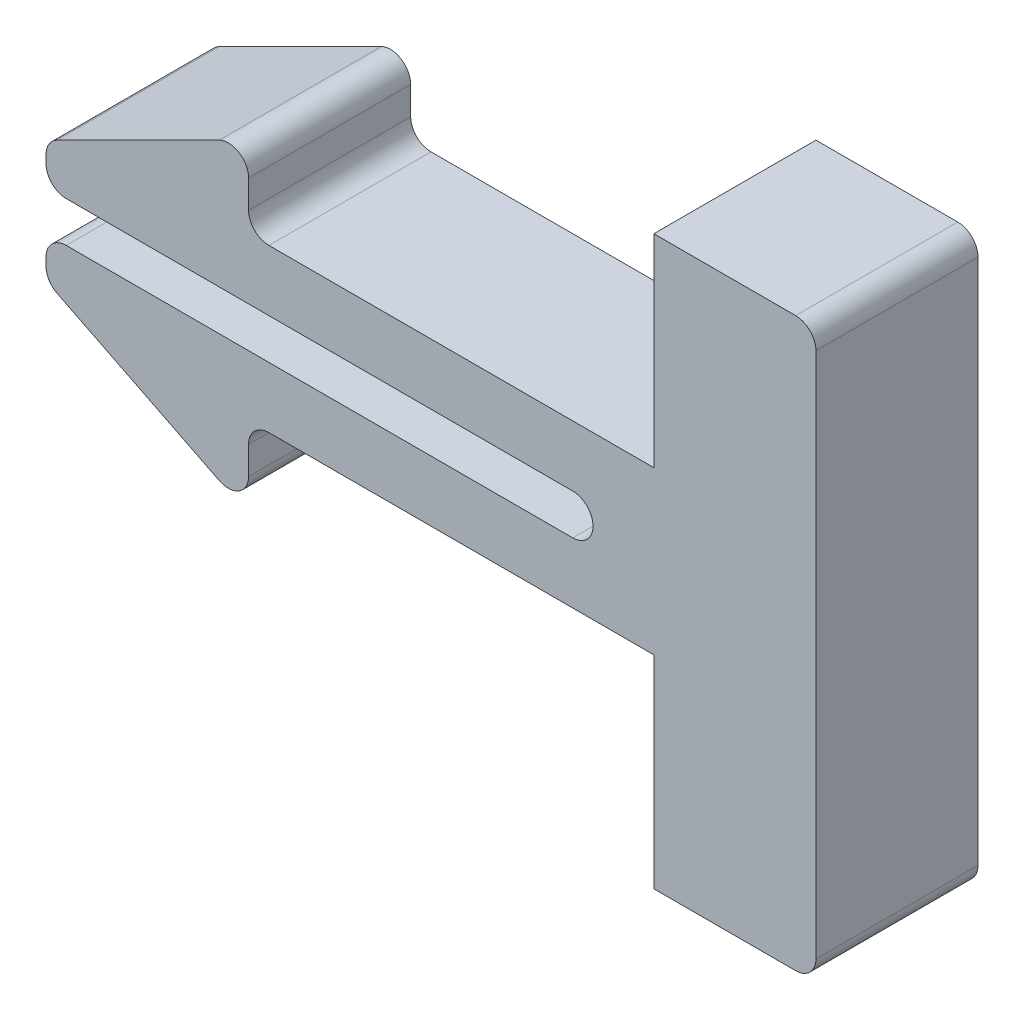
ISO-10303-21;
HEADER;
FILE_DESCRIPTION(('STEP AP214'),'2;1');
FILE_NAME('part.step','',(''),(''),'','','');
FILE_SCHEMA(('AUTOMOTIVE_DESIGN { 1 0 10303 214 1 1 1 1 }'));
ENDSEC;
DATA;
#1=APPLICATION_CONTEXT('core data for automotive mechanical design processes');
#2=APPLICATION_PROTOCOL_DEFINITION('international standard','automotive_design',2000,#1);
#3=PRODUCT_CONTEXT('',#1,'mechanical');
#4=PRODUCT('Part','Part','',(#3));
#5=PRODUCT_RELATED_PRODUCT_CATEGORY('part','',(#4));
#6=PRODUCT_DEFINITION_FORMATION('','',#4);
#7=PRODUCT_DEFINITION_CONTEXT('part definition',#1,'design');
#8=PRODUCT_DEFINITION('design','',#6,#7);
#9=PRODUCT_DEFINITION_SHAPE('','',#8);
#10=(LENGTH_UNIT() NAMED_UNIT(*) SI_UNIT(.MILLI.,.METRE.));
#11=(NAMED_UNIT(*) PLANE_ANGLE_UNIT() SI_UNIT($,.RADIAN.));
#12=(NAMED_UNIT(*) SI_UNIT($,.STERADIAN.) SOLID_ANGLE_UNIT());
#13=UNCERTAINTY_MEASURE_WITH_UNIT(LENGTH_MEASURE(1.E-05),#10,'distance_accuracy_value','');
#14=(GEOMETRIC_REPRESENTATION_CONTEXT(3) GLOBAL_UNCERTAINTY_ASSIGNED_CONTEXT((#13)) GLOBAL_UNIT_ASSIGNED_CONTEXT((#10,
#11,#12)) REPRESENTATION_CONTEXT('',''));
#15=CARTESIAN_POINT('',(0.,0.,0.));
#16=DIRECTION('',(0.,0.,1.));
#17=DIRECTION('',(1.,0.,0.));
#18=AXIS2_PLACEMENT_3D('',#15,#16,#17);
#19=CARTESIAN_POINT('',(17.7568132742083,178.880197559472,-174.481230173254));
#20=DIRECTION('',(0.,-1.,0.));
#21=DIRECTION('',(0.,0.,-1.));
#22=AXIS2_PLACEMENT_3D('',#19,#20,#21);
#23=PLANE('',#22);
#24=DIRECTION('',(1.,0.,0.));
#25=VECTOR('',#24,1.);
#26=CARTESIAN_POINT('',(17.7568132742083,178.880197559472,-7.99999999999998));
#27=LINE('',#26,#25);
#28=CARTESIAN_POINT('',(9.75681327420834,178.880197559472,-7.99999999999998));
#29=VERTEX_POINT('',#28);
#30=CARTESIAN_POINT('',(16.7568132742083,178.880197559472,-7.99999999999998));
#31=VERTEX_POINT('',#30);
#32=EDGE_CURVE('E234',#29,#31,#27,.T.);
#33=ORIENTED_EDGE('',*,*,#32,.T.);
#34=DIRECTION('',(0.,0.,1.));
#35=VECTOR('',#34,1.);
#36=CARTESIAN_POINT('',(16.7568132742083,178.880197559472,-174.481230173254));
#37=LINE('',#36,#35);
#38=CARTESIAN_POINT('',(16.7568132742083,178.880197559472,0.));
#39=VERTEX_POINT('',#38);
#40=EDGE_CURVE('E240',#31,#39,#37,.T.);
#41=ORIENTED_EDGE('',*,*,#40,.T.);
#42=DIRECTION('',(1.,0.,0.));
#43=VECTOR('',#42,1.);
#44=CARTESIAN_POINT('',(17.7568132742083,178.880197559472,0.));
#45=LINE('',#44,#43);
#46=CARTESIAN_POINT('',(9.75681327420834,178.880197559472,0.));
#47=VERTEX_POINT('',#46);
#48=EDGE_CURVE('E238',#47,#39,#45,.T.);
#49=ORIENTED_EDGE('',*,*,#48,.F.);
#50=DIRECTION('',(0.,0.,1.));
#51=VECTOR('',#50,1.);
#52=CARTESIAN_POINT('',(9.75681327420834,178.880197559472,-174.481230173254));
#53=LINE('',#52,#51);
#54=EDGE_CURVE('E224',#29,#47,#53,.T.);
#55=ORIENTED_EDGE('',*,*,#54,.F.);
#56=EDGE_LOOP('',(#33,#41,#49,#55));
#57=FACE_BOUND('',#56,.T.);
#58=ADVANCED_FACE('F45',(#57),#23,.T.);
#59=CARTESIAN_POINT('',(9.75681327420834,178.880197559472,-174.481230173254));
#60=DIRECTION('',(-1.,0.,0.));
#61=DIRECTION('',(0.,0.,1.));
#62=AXIS2_PLACEMENT_3D('',#59,#60,#61);
#63=PLANE('',#62);
#64=DIRECTION('',(0.,0.,1.));
#65=VECTOR('',#64,1.);
#66=CARTESIAN_POINT('',(9.75681327420834,188.880197559472,-174.481230173254));
#67=LINE('',#66,#65);
#68=CARTESIAN_POINT('',(9.75681327420834,188.880197559472,-7.99999999999998));
#69=VERTEX_POINT('',#68);
#70=CARTESIAN_POINT('',(9.75681327420834,188.880197559472,0.));
#71=VERTEX_POINT('',#70);
#72=EDGE_CURVE('E290',#69,#71,#67,.T.);
#73=ORIENTED_EDGE('',*,*,#72,.F.);
#74=DIRECTION('',(0.,-1.,0.));
#75=VECTOR('',#74,1.);
#76=CARTESIAN_POINT('',(9.75681327420834,178.880197559472,-7.99999999999998));
#77=LINE('',#76,#75);
#78=EDGE_CURVE('E231',#69,#29,#77,.T.);
#79=ORIENTED_EDGE('',*,*,#78,.T.);
#80=ORIENTED_EDGE('',*,*,#54,.T.);
#81=DIRECTION('',(0.,-1.,0.));
#82=VECTOR('',#81,1.);
#83=CARTESIAN_POINT('',(9.75681327420834,178.880197559472,0.));
#84=LINE('',#83,#82);
#85=EDGE_CURVE('E229',#71,#47,#84,.T.);
#86=ORIENTED_EDGE('',*,*,#85,.F.);
#87=EDGE_LOOP('',(#73,#79,#80,#86));
#88=FACE_BOUND('',#87,.T.);
#89=ADVANCED_FACE('F227',(#88),#63,.T.);
#90=CARTESIAN_POINT('',(9.75681327420834,188.880197559472,-174.481230173254));
#91=DIRECTION('',(0.,-1.,0.));
#92=DIRECTION('',(1.,0.,0.));
#93=AXIS2_PLACEMENT_3D('',#90,#91,#92);
#94=PLANE('',#93);
#95=DIRECTION('',(1.,0.,0.));
#96=VECTOR('',#95,1.);
#97=CARTESIAN_POINT('',(9.75681327420834,188.880197559472,0.));
#98=LINE('',#97,#96);
#99=CARTESIAN_POINT('',(-9.24318672579167,188.880197559472,0.));
#100=VERTEX_POINT('',#99);
#101=EDGE_CURVE('E247',#100,#71,#98,.T.);
#102=ORIENTED_EDGE('',*,*,#101,.F.);
#103=DIRECTION('',(0.,0.,1.));
#104=VECTOR('',#103,1.);
#105=CARTESIAN_POINT('',(-9.24318672579167,188.880197559472,-7.99999999999998));
#106=LINE('',#105,#104);
#107=CARTESIAN_POINT('',(-9.24318672579167,188.880197559472,-7.99999999999998));
#108=VERTEX_POINT('',#107);
#109=EDGE_CURVE('E368',#100,#108,#106,.F.);
#110=ORIENTED_EDGE('',*,*,#109,.T.);
#111=DIRECTION('',(1.,0.,0.));
#112=VECTOR('',#111,1.);
#113=CARTESIAN_POINT('',(9.75681327420834,188.880197559472,-7.99999999999998));
#114=LINE('',#113,#112);
#115=EDGE_CURVE('E291',#108,#69,#114,.T.);
#116=ORIENTED_EDGE('',*,*,#115,.T.);
#117=ORIENTED_EDGE('',*,*,#72,.T.);
#118=EDGE_LOOP('',(#102,#110,#116,#117));
#119=FACE_BOUND('',#118,.T.);
#120=ADVANCED_FACE('F464',(#119),#94,.T.);
#121=CARTESIAN_POINT('',(-9.24318672579167,187.880197559472,-174.481230173254));
#122=DIRECTION('',(0.,0.,-1.));
#123=DIRECTION('',(-1.,0.,0.));
#124=AXIS2_PLACEMENT_3D('',#121,#122,#123);
#125=CYLINDRICAL_SURFACE('',#124,1.);
#126=CARTESIAN_POINT('',(-9.24318672579167,187.880197559472,-7.99999999999998));
#127=DIRECTION('',(0.,0.,-1.));
#128=DIRECTION('',(0.,1.,0.));
#129=AXIS2_PLACEMENT_3D('',#126,#127,#128);
#130=CIRCLE('',#129,1.);
#131=CARTESIAN_POINT('',(-10.2431867257917,187.880197559472,-7.99999999999998));
#132=VERTEX_POINT('',#131);
#133=EDGE_CURVE('E428',#108,#132,#130,.F.);
#134=ORIENTED_EDGE('',*,*,#133,.F.);
#135=ORIENTED_EDGE('',*,*,#109,.F.);
#136=CARTESIAN_POINT('',(-9.24318672579167,187.880197559472,0.));
#137=DIRECTION('',(0.,0.,-1.));
#138=DIRECTION('',(-1.,0.,0.));
#139=AXIS2_PLACEMENT_3D('',#136,#137,#138);
#140=CIRCLE('',#139,1.);
#141=CARTESIAN_POINT('',(-10.2431867257917,187.880197559472,0.));
#142=VERTEX_POINT('',#141);
#143=EDGE_CURVE('E426',#142,#100,#140,.T.);
#144=ORIENTED_EDGE('',*,*,#143,.F.);
#145=DIRECTION('',(0.,0.,1.));
#146=VECTOR('',#145,1.);
#147=CARTESIAN_POINT('',(-10.2431867257917,187.880197559472,0.));
#148=LINE('',#147,#146);
#149=EDGE_CURVE('E365',#132,#142,#148,.T.);
#150=ORIENTED_EDGE('',*,*,#149,.F.);
#151=EDGE_LOOP('',(#134,#135,#144,#150));
#152=FACE_BOUND('',#151,.T.);
#153=ADVANCED_FACE('F467',(#152),#125,.F.);
#154=CARTESIAN_POINT('',(-10.2431867257917,184.880197559472,-174.481230173254));
#155=DIRECTION('',(1.,0.,0.));
#156=DIRECTION('',(0.,1.,0.));
#157=AXIS2_PLACEMENT_3D('',#154,#155,#156);
#158=PLANE('',#157);
#159=DIRECTION('',(0.,1.,0.));
#160=VECTOR('',#159,1.);
#161=CARTESIAN_POINT('',(-10.2431867257917,184.880197559472,-7.99999999999998));
#162=LINE('',#161,#160);
#163=CARTESIAN_POINT('',(-10.2431867257917,186.498231548222,-7.99999999999998));
#164=VERTEX_POINT('',#163);
#165=EDGE_CURVE('E293',#164,#132,#162,.T.);
#166=ORIENTED_EDGE('',*,*,#165,.T.);
#167=ORIENTED_EDGE('',*,*,#149,.T.);
#168=DIRECTION('',(0.,1.,0.));
#169=VECTOR('',#168,1.);
#170=CARTESIAN_POINT('',(-10.2431867257917,184.880197559472,0.));
#171=LINE('',#170,#169);
#172=CARTESIAN_POINT('',(-10.2431867257917,186.498231548222,0.));
#173=VERTEX_POINT('',#172);
#174=EDGE_CURVE('E250',#173,#142,#171,.T.);
#175=ORIENTED_EDGE('',*,*,#174,.F.);
#176=DIRECTION('',(0.,0.,1.));
#177=VECTOR('',#176,1.);
#178=CARTESIAN_POINT('',(-10.2431867257917,186.498231548222,-174.481230173254));
#179=LINE('',#178,#177);
#180=EDGE_CURVE('E361',#173,#164,#179,.F.);
#181=ORIENTED_EDGE('',*,*,#180,.T.);
#182=EDGE_LOOP('',(#166,#167,#175,#181));
#183=FACE_BOUND('',#182,.T.);
#184=ADVANCED_FACE('F472',(#183),#158,.T.);
#185=CARTESIAN_POINT('',(-11.2431867257917,186.498231548222,-174.481230173254));
#186=DIRECTION('',(0.,0.,1.));
#187=DIRECTION('',(1.,0.,0.));
#188=AXIS2_PLACEMENT_3D('',#185,#186,#187);
#189=CYLINDRICAL_SURFACE('',#188,1.);
#190=CARTESIAN_POINT('',(-11.2431867257917,186.498231548222,-7.99999999999998));
#191=DIRECTION('',(0.,0.,-1.));
#192=DIRECTION('',(0.,1.,0.));
#193=AXIS2_PLACEMENT_3D('',#190,#191,#192);
#194=CIRCLE('',#193,1.);
#195=CARTESIAN_POINT('',(-11.6904003212916,185.603804357222,-7.99999999999998));
#196=VERTEX_POINT('',#195);
#197=EDGE_CURVE('E396',#164,#196,#194,.T.);
#198=ORIENTED_EDGE('',*,*,#197,.F.);
#199=ORIENTED_EDGE('',*,*,#180,.F.);
#200=CARTESIAN_POINT('',(-11.2431867257917,186.498231548222,0.));
#201=DIRECTION('',(0.,0.,-1.));
#202=DIRECTION('',(-1.,0.,0.));
#203=AXIS2_PLACEMENT_3D('',#200,#201,#202);
#204=CIRCLE('',#203,1.);
#205=CARTESIAN_POINT('',(-11.6904003212916,185.603804357222,0.));
#206=VERTEX_POINT('',#205);
#207=EDGE_CURVE('E385',#206,#173,#204,.F.);
#208=ORIENTED_EDGE('',*,*,#207,.F.);
#209=DIRECTION('',(0.,0.,1.));
#210=VECTOR('',#209,1.);
#211=CARTESIAN_POINT('',(-11.6904003212916,185.603804357222,-174.481230173254));
#212=LINE('',#211,#210);
#213=EDGE_CURVE('E372',#196,#206,#212,.T.);
#214=ORIENTED_EDGE('',*,*,#213,.F.);
#215=EDGE_LOOP('',(#198,#199,#208,#214));
#216=FACE_BOUND('',#215,.T.);
#217=ADVANCED_FACE('F476',(#216),#189,.T.);
#218=CARTESIAN_POINT('',(-20.2431867257917,189.880197559472,-174.481230173254));
#219=DIRECTION('',(-0.447213595499958,-0.894427190999916,0.));
#220=DIRECTION('',(0.894427190999916,-0.447213595499958,0.));
#221=AXIS2_PLACEMENT_3D('',#218,#219,#220);
#222=PLANE('',#221);
#223=DIRECTION('',(0.894427190999916,-0.447213595499958,0.));
#224=VECTOR('',#223,1.);
#225=CARTESIAN_POINT('',(-20.2431867257917,189.880197559472,-7.99999999999998));
#226=LINE('',#225,#224);
#227=CARTESIAN_POINT('',(-19.6904003212916,189.603804357222,-7.99999999999998));
#228=VERTEX_POINT('',#227);
#229=EDGE_CURVE('E296',#228,#196,#226,.T.);
#230=ORIENTED_EDGE('',*,*,#229,.T.);
#231=ORIENTED_EDGE('',*,*,#213,.T.);
#232=DIRECTION('',(0.894427190999916,-0.447213595499958,0.));
#233=VECTOR('',#232,1.);
#234=CARTESIAN_POINT('',(-20.2431867257917,189.880197559472,0.));
#235=LINE('',#234,#233);
#236=CARTESIAN_POINT('',(-19.6904003212916,189.603804357222,0.));
#237=VERTEX_POINT('',#236);
#238=EDGE_CURVE('E255',#237,#206,#235,.T.);
#239=ORIENTED_EDGE('',*,*,#238,.F.);
#240=DIRECTION('',(0.,0.,1.));
#241=VECTOR('',#240,1.);
#242=CARTESIAN_POINT('',(-19.6904003212916,189.603804357222,-174.481230173254));
#243=LINE('',#242,#241);
#244=EDGE_CURVE('E370',#237,#228,#243,.F.);
#245=ORIENTED_EDGE('',*,*,#244,.T.);
#246=EDGE_LOOP('',(#230,#231,#239,#245));
#247=FACE_BOUND('',#246,.T.);
#248=ADVANCED_FACE('F481',(#247),#222,.T.);
#249=CARTESIAN_POINT('',(-19.2431867257917,190.498231548222,-174.481230173254));
#250=DIRECTION('',(0.,0.,1.));
#251=DIRECTION('',(1.,0.,0.));
#252=AXIS2_PLACEMENT_3D('',#249,#250,#251);
#253=CYLINDRICAL_SURFACE('',#252,1.);
#254=CARTESIAN_POINT('',(-19.2431867257917,190.498231548222,-7.99999999999998));
#255=DIRECTION('',(0.,0.,-1.));
#256=DIRECTION('',(0.,1.,0.));
#257=AXIS2_PLACEMENT_3D('',#254,#255,#256);
#258=CIRCLE('',#257,1.);
#259=CARTESIAN_POINT('',(-20.2431867257917,190.498231548222,-7.99999999999998));
#260=VERTEX_POINT('',#259);
#261=EDGE_CURVE('E394',#228,#260,#258,.T.);
#262=ORIENTED_EDGE('',*,*,#261,.F.);
#263=ORIENTED_EDGE('',*,*,#244,.F.);
#264=CARTESIAN_POINT('',(-19.2431867257917,190.498231548222,0.));
#265=DIRECTION('',(0.,0.,-1.));
#266=DIRECTION('',(-1.,0.,0.));
#267=AXIS2_PLACEMENT_3D('',#264,#265,#266);
#268=CIRCLE('',#267,1.);
#269=CARTESIAN_POINT('',(-20.2431867257917,190.498231548222,0.));
#270=VERTEX_POINT('',#269);
#271=EDGE_CURVE('E383',#270,#237,#268,.F.);
#272=ORIENTED_EDGE('',*,*,#271,.F.);
#273=DIRECTION('',(0.,0.,1.));
#274=VECTOR('',#273,1.);
#275=CARTESIAN_POINT('',(-20.2431867257917,190.498231548222,-174.481230173254));
#276=LINE('',#275,#274);
#277=EDGE_CURVE('E400',#260,#270,#276,.T.);
#278=ORIENTED_EDGE('',*,*,#277,.F.);
#279=EDGE_LOOP('',(#262,#263,#272,#278));
#280=FACE_BOUND('',#279,.T.);
#281=ADVANCED_FACE('F485',(#280),#253,.T.);
#282=CARTESIAN_POINT('',(-20.2431867257917,191.880197559472,-174.481230173254));
#283=DIRECTION('',(-1.,0.,0.));
#284=DIRECTION('',(0.,0.,1.));
#285=AXIS2_PLACEMENT_3D('',#282,#283,#284);
#286=PLANE('',#285);
#287=DIRECTION('',(0.,-1.,0.));
#288=VECTOR('',#287,1.);
#289=CARTESIAN_POINT('',(-20.2431867257917,191.880197559472,-7.99999999999998));
#290=LINE('',#289,#288);
#291=CARTESIAN_POINT('',(-20.2431867257917,190.880197559472,-7.99999999999998));
#292=VERTEX_POINT('',#291);
#293=EDGE_CURVE('E299',#292,#260,#290,.T.);
#294=ORIENTED_EDGE('',*,*,#293,.T.);
#295=ORIENTED_EDGE('',*,*,#277,.T.);
#296=DIRECTION('',(0.,-1.,0.));
#297=VECTOR('',#296,1.);
#298=CARTESIAN_POINT('',(-20.2431867257917,191.880197559472,0.));
#299=LINE('',#298,#297);
#300=CARTESIAN_POINT('',(-20.2431867257917,190.880197559472,0.));
#301=VERTEX_POINT('',#300);
#302=EDGE_CURVE('E258',#301,#270,#299,.T.);
#303=ORIENTED_EDGE('',*,*,#302,.F.);
#304=DIRECTION('',(0.,0.,1.));
#305=VECTOR('',#304,1.);
#306=CARTESIAN_POINT('',(-20.2431867257917,190.880197559472,-174.481230173254));
#307=LINE('',#306,#305);
#308=EDGE_CURVE('E398',#301,#292,#307,.F.);
#309=ORIENTED_EDGE('',*,*,#308,.T.);
#310=EDGE_LOOP('',(#294,#295,#303,#309));
#311=FACE_BOUND('',#310,.T.);
#312=ADVANCED_FACE('F490',(#311),#286,.T.);
#313=CARTESIAN_POINT('',(-19.2431867257917,190.880197559472,-174.481230173254));
#314=DIRECTION('',(0.,0.,1.));
#315=DIRECTION('',(1.,0.,0.));
#316=AXIS2_PLACEMENT_3D('',#313,#314,#315);
#317=CYLINDRICAL_SURFACE('',#316,1.);
#318=CARTESIAN_POINT('',(-19.2431867257917,190.880197559472,-7.99999999999998));
#319=DIRECTION('',(0.,0.,-1.));
#320=DIRECTION('',(0.,1.,0.));
#321=AXIS2_PLACEMENT_3D('',#318,#319,#320);
#322=CIRCLE('',#321,1.);
#323=CARTESIAN_POINT('',(-19.2431867257917,191.880197559472,-7.99999999999998));
#324=VERTEX_POINT('',#323);
#325=EDGE_CURVE('E392',#292,#324,#322,.T.);
#326=ORIENTED_EDGE('',*,*,#325,.F.);
#327=ORIENTED_EDGE('',*,*,#308,.F.);
#328=CARTESIAN_POINT('',(-19.2431867257917,190.880197559472,0.));
#329=DIRECTION('',(0.,0.,-1.));
#330=DIRECTION('',(-1.,0.,0.));
#331=AXIS2_PLACEMENT_3D('',#328,#329,#330);
#332=CIRCLE('',#331,1.);
#333=CARTESIAN_POINT('',(-19.2431867257917,191.880197559472,0.));
#334=VERTEX_POINT('',#333);
#335=EDGE_CURVE('E381',#334,#301,#332,.F.);
#336=ORIENTED_EDGE('',*,*,#335,.F.);
#337=DIRECTION('',(0.,0.,1.));
#338=VECTOR('',#337,1.);
#339=CARTESIAN_POINT('',(-19.2431867257917,191.880197559472,-174.481230173254));
#340=LINE('',#339,#338);
#341=EDGE_CURVE('E403',#324,#334,#340,.T.);
#342=ORIENTED_EDGE('',*,*,#341,.F.);
#343=EDGE_LOOP('',(#326,#327,#336,#342));
#344=FACE_BOUND('',#343,.T.);
#345=ADVANCED_FACE('F494',(#344),#317,.T.);
#346=CARTESIAN_POINT('',(6.75681327420834,191.880197559472,-174.481230173254));
#347=DIRECTION('',(0.,1.,0.));
#348=DIRECTION('',(0.,0.,1.));
#349=AXIS2_PLACEMENT_3D('',#346,#347,#348);
#350=PLANE('',#349);
#351=DIRECTION('',(-1.,0.,0.));
#352=VECTOR('',#351,1.);
#353=CARTESIAN_POINT('',(6.75681327420834,191.880197559472,-7.99999999999998));
#354=LINE('',#353,#352);
#355=CARTESIAN_POINT('',(5.75681327420834,191.880197559472,-7.99999999999998));
#356=VERTEX_POINT('',#355);
#357=EDGE_CURVE('E302',#356,#324,#354,.T.);
#358=ORIENTED_EDGE('',*,*,#357,.T.);
#359=ORIENTED_EDGE('',*,*,#341,.T.);
#360=DIRECTION('',(-1.,0.,0.));
#361=VECTOR('',#360,1.);
#362=CARTESIAN_POINT('',(6.75681327420834,191.880197559472,0.));
#363=LINE('',#362,#361);
#364=CARTESIAN_POINT('',(5.75681327420834,191.880197559472,0.));
#365=VERTEX_POINT('',#364);
#366=EDGE_CURVE('E261',#365,#334,#363,.T.);
#367=ORIENTED_EDGE('',*,*,#366,.F.);
#368=DIRECTION('',(0.,0.,1.));
#369=VECTOR('',#368,1.);
#370=CARTESIAN_POINT('',(5.75681327420834,191.880197559472,-7.99999999999998));
#371=LINE('',#370,#369);
#372=EDGE_CURVE('E346',#365,#356,#371,.F.);
#373=ORIENTED_EDGE('',*,*,#372,.T.);
#374=EDGE_LOOP('',(#358,#359,#367,#373));
#375=FACE_BOUND('',#374,.T.);
#376=ADVANCED_FACE('F498',(#375),#350,.T.);
#377=CARTESIAN_POINT('',(5.75681327420834,192.880197559472,-174.481230173254));
#378=DIRECTION('',(0.,0.,-1.));
#379=DIRECTION('',(-1.,0.,0.));
#380=AXIS2_PLACEMENT_3D('',#377,#378,#379);
#381=CYLINDRICAL_SURFACE('',#380,1.);
#382=CARTESIAN_POINT('',(5.75681327420834,192.880197559472,-7.99999999999998));
#383=DIRECTION('',(0.,0.,-1.));
#384=DIRECTION('',(0.,1.,0.));
#385=AXIS2_PLACEMENT_3D('',#382,#383,#384);
#386=CIRCLE('',#385,1.);
#387=CARTESIAN_POINT('',(6.75681327420834,192.880197559472,-7.99999999999998));
#388=VERTEX_POINT('',#387);
#389=EDGE_CURVE('E354',#356,#388,#386,.F.);
#390=ORIENTED_EDGE('',*,*,#389,.F.);
#391=ORIENTED_EDGE('',*,*,#372,.F.);
#392=CARTESIAN_POINT('',(5.75681327420834,192.880197559472,0.));
#393=DIRECTION('',(0.,0.,-1.));
#394=DIRECTION('',(-1.,0.,0.));
#395=AXIS2_PLACEMENT_3D('',#392,#393,#394);
#396=CIRCLE('',#395,1.);
#397=CARTESIAN_POINT('',(6.75681327420834,192.880197559472,0.));
#398=VERTEX_POINT('',#397);
#399=EDGE_CURVE('E352',#398,#365,#396,.T.);
#400=ORIENTED_EDGE('',*,*,#399,.F.);
#401=DIRECTION('',(0.,0.,1.));
#402=VECTOR('',#401,1.);
#403=CARTESIAN_POINT('',(6.75681327420834,192.880197559472,-7.99999999999998));
#404=LINE('',#403,#402);
#405=EDGE_CURVE('E286',#398,#388,#404,.F.);
#406=ORIENTED_EDGE('',*,*,#405,.T.);
#407=EDGE_LOOP('',(#390,#391,#400,#406));
#408=FACE_BOUND('',#407,.T.);
#409=ADVANCED_FACE('F503',(#408),#381,.F.);
#410=CARTESIAN_POINT('',(5.75681327420834,192.880197559472,-174.481230173254));
#411=DIRECTION('',(0.,0.,-1.));
#412=DIRECTION('',(-1.,0.,0.));
#413=AXIS2_PLACEMENT_3D('',#410,#411,#412);
#414=CYLINDRICAL_SURFACE('',#413,1.);
#415=DIRECTION('',(0.,0.,1.));
#416=VECTOR('',#415,1.);
#417=CARTESIAN_POINT('',(5.75681327420834,193.880197559472,0.));
#418=LINE('',#417,#416);
#419=CARTESIAN_POINT('',(5.75681327420834,193.880197559472,-7.99999999999998));
#420=VERTEX_POINT('',#419);
#421=CARTESIAN_POINT('',(5.75681327420834,193.880197559472,0.));
#422=VERTEX_POINT('',#421);
#423=EDGE_CURVE('E349',#420,#422,#418,.T.);
#424=ORIENTED_EDGE('',*,*,#423,.F.);
#425=CARTESIAN_POINT('',(5.75681327420834,192.880197559472,-7.99999999999998));
#426=DIRECTION('',(0.,0.,-1.));
#427=DIRECTION('',(0.,1.,0.));
#428=AXIS2_PLACEMENT_3D('',#425,#426,#427);
#429=CIRCLE('',#428,1.);
#430=EDGE_CURVE('E358',#388,#420,#429,.F.);
#431=ORIENTED_EDGE('',*,*,#430,.F.);
#432=ORIENTED_EDGE('',*,*,#405,.F.);
#433=CARTESIAN_POINT('',(5.75681327420834,192.880197559472,0.));
#434=DIRECTION('',(0.,0.,-1.));
#435=DIRECTION('',(-1.,0.,0.));
#436=AXIS2_PLACEMENT_3D('',#433,#434,#435);
#437=CIRCLE('',#436,1.);
#438=EDGE_CURVE('E356',#422,#398,#437,.T.);
#439=ORIENTED_EDGE('',*,*,#438,.F.);
#440=EDGE_LOOP('',(#424,#431,#432,#439));
#441=FACE_BOUND('',#440,.T.);
#442=ADVANCED_FACE('F509',(#441),#414,.F.);
#443=CARTESIAN_POINT('',(-20.2431867257917,193.880197559472,-174.481230173254));
#444=DIRECTION('',(0.,-1.,0.));
#445=DIRECTION('',(0.,0.,-1.));
#446=AXIS2_PLACEMENT_3D('',#443,#444,#445);
#447=PLANE('',#446);
#448=DIRECTION('',(1.,0.,0.));
#449=VECTOR('',#448,1.);
#450=CARTESIAN_POINT('',(-20.2431867257917,193.880197559472,0.));
#451=LINE('',#450,#449);
#452=CARTESIAN_POINT('',(-19.2431867257917,193.880197559472,0.));
#453=VERTEX_POINT('',#452);
#454=EDGE_CURVE('E264',#453,#422,#451,.T.);
#455=ORIENTED_EDGE('',*,*,#454,.F.);
#456=DIRECTION('',(0.,0.,1.));
#457=VECTOR('',#456,1.);
#458=CARTESIAN_POINT('',(-19.2431867257917,193.880197559472,-174.481230173254));
#459=LINE('',#458,#457);
#460=CARTESIAN_POINT('',(-19.2431867257917,193.880197559472,-7.99999999999998));
#461=VERTEX_POINT('',#460);
#462=EDGE_CURVE('E411',#453,#461,#459,.F.);
#463=ORIENTED_EDGE('',*,*,#462,.T.);
#464=DIRECTION('',(1.,0.,0.));
#465=VECTOR('',#464,1.);
#466=CARTESIAN_POINT('',(-20.2431867257917,193.880197559472,-7.99999999999998));
#467=LINE('',#466,#465);
#468=EDGE_CURVE('E305',#461,#420,#467,.T.);
#469=ORIENTED_EDGE('',*,*,#468,.T.);
#470=ORIENTED_EDGE('',*,*,#423,.T.);
#471=EDGE_LOOP('',(#455,#463,#469,#470));
#472=FACE_BOUND('',#471,.T.);
#473=ADVANCED_FACE('F513',(#472),#447,.T.);
#474=CARTESIAN_POINT('',(-19.2431867257917,194.880197559472,-174.481230173254));
#475=DIRECTION('',(0.,0.,1.));
#476=DIRECTION('',(1.,0.,0.));
#477=AXIS2_PLACEMENT_3D('',#474,#475,#476);
#478=CYLINDRICAL_SURFACE('',#477,1.);
#479=CARTESIAN_POINT('',(-19.2431867257917,194.880197559472,-7.99999999999998));
#480=DIRECTION('',(0.,0.,-1.));
#481=DIRECTION('',(0.,1.,0.));
#482=AXIS2_PLACEMENT_3D('',#479,#480,#481);
#483=CIRCLE('',#482,1.);
#484=CARTESIAN_POINT('',(-20.2431867257917,194.880197559472,-7.99999999999998));
#485=VERTEX_POINT('',#484);
#486=EDGE_CURVE('E390',#461,#485,#483,.T.);
#487=ORIENTED_EDGE('',*,*,#486,.F.);
#488=ORIENTED_EDGE('',*,*,#462,.F.);
#489=CARTESIAN_POINT('',(-19.2431867257917,194.880197559472,0.));
#490=DIRECTION('',(0.,0.,-1.));
#491=DIRECTION('',(-1.,0.,0.));
#492=AXIS2_PLACEMENT_3D('',#489,#490,#491);
#493=CIRCLE('',#492,1.);
#494=CARTESIAN_POINT('',(-20.2431867257917,194.880197559472,0.));
#495=VERTEX_POINT('',#494);
#496=EDGE_CURVE('E379',#495,#453,#493,.F.);
#497=ORIENTED_EDGE('',*,*,#496,.F.);
#498=DIRECTION('',(0.,0.,1.));
#499=VECTOR('',#498,1.);
#500=CARTESIAN_POINT('',(-20.2431867257917,194.880197559472,-174.481230173254));
#501=LINE('',#500,#499);
#502=EDGE_CURVE('E408',#485,#495,#501,.T.);
#503=ORIENTED_EDGE('',*,*,#502,.F.);
#504=EDGE_LOOP('',(#487,#488,#497,#503));
#505=FACE_BOUND('',#504,.T.);
#506=ADVANCED_FACE('F519',(#505),#478,.T.);
#507=CARTESIAN_POINT('',(-20.2431867257917,195.880197559472,-174.481230173254));
#508=DIRECTION('',(-1.,0.,0.));
#509=DIRECTION('',(0.,0.,1.));
#510=AXIS2_PLACEMENT_3D('',#507,#508,#509);
#511=PLANE('',#510);
#512=DIRECTION('',(0.,-1.,0.));
#513=VECTOR('',#512,1.);
#514=CARTESIAN_POINT('',(-20.2431867257917,195.880197559472,-7.99999999999998));
#515=LINE('',#514,#513);
#516=CARTESIAN_POINT('',(-20.2431867257917,195.262163570722,-7.99999999999998));
#517=VERTEX_POINT('',#516);
#518=EDGE_CURVE('E307',#517,#485,#515,.T.);
#519=ORIENTED_EDGE('',*,*,#518,.T.);
#520=ORIENTED_EDGE('',*,*,#502,.T.);
#521=DIRECTION('',(0.,-1.,0.));
#522=VECTOR('',#521,1.);
#523=CARTESIAN_POINT('',(-20.2431867257917,195.880197559472,0.));
#524=LINE('',#523,#522);
#525=CARTESIAN_POINT('',(-20.2431867257917,195.262163570722,0.));
#526=VERTEX_POINT('',#525);
#527=EDGE_CURVE('E266',#526,#495,#524,.T.);
#528=ORIENTED_EDGE('',*,*,#527,.F.);
#529=DIRECTION('',(0.,0.,1.));
#530=VECTOR('',#529,1.);
#531=CARTESIAN_POINT('',(-20.2431867257917,195.262163570722,-174.481230173254));
#532=LINE('',#531,#530);
#533=EDGE_CURVE('E406',#526,#517,#532,.F.);
#534=ORIENTED_EDGE('',*,*,#533,.T.);
#535=EDGE_LOOP('',(#519,#520,#528,#534));
#536=FACE_BOUND('',#535,.T.);
#537=ADVANCED_FACE('F522',(#536),#511,.T.);
#538=CARTESIAN_POINT('',(-19.2431867257917,195.262163570722,-174.481230173254));
#539=DIRECTION('',(0.,0.,1.));
#540=DIRECTION('',(1.,0.,0.));
#541=AXIS2_PLACEMENT_3D('',#538,#539,#540);
#542=CYLINDRICAL_SURFACE('',#541,1.);
#543=CARTESIAN_POINT('',(-19.2431867257917,195.262163570722,-7.99999999999998));
#544=DIRECTION('',(0.,0.,-1.));
#545=DIRECTION('',(0.,1.,0.));
#546=AXIS2_PLACEMENT_3D('',#543,#544,#545);
#547=CIRCLE('',#546,1.);
#548=CARTESIAN_POINT('',(-19.6904003212916,196.156590761722,-7.99999999999998));
#549=VERTEX_POINT('',#548);
#550=EDGE_CURVE('E388',#517,#549,#547,.T.);
#551=ORIENTED_EDGE('',*,*,#550,.F.);
#552=ORIENTED_EDGE('',*,*,#533,.F.);
#553=CARTESIAN_POINT('',(-19.2431867257917,195.262163570722,0.));
#554=DIRECTION('',(0.,0.,-1.));
#555=DIRECTION('',(-1.,0.,0.));
#556=AXIS2_PLACEMENT_3D('',#553,#554,#555);
#557=CIRCLE('',#556,1.);
#558=CARTESIAN_POINT('',(-19.6904003212916,196.156590761722,0.));
#559=VERTEX_POINT('',#558);
#560=EDGE_CURVE('E377',#559,#526,#557,.F.);
#561=ORIENTED_EDGE('',*,*,#560,.F.);
#562=DIRECTION('',(0.,0.,1.));
#563=VECTOR('',#562,1.);
#564=CARTESIAN_POINT('',(-19.6904003212916,196.156590761722,-174.481230173254));
#565=LINE('',#564,#563);
#566=EDGE_CURVE('E415',#549,#559,#565,.T.);
#567=ORIENTED_EDGE('',*,*,#566,.F.);
#568=EDGE_LOOP('',(#551,#552,#561,#567));
#569=FACE_BOUND('',#568,.T.);
#570=ADVANCED_FACE('F528',(#569),#542,.T.);
#571=CARTESIAN_POINT('',(-10.2431867257917,200.880197559472,-174.481230173254));
#572=DIRECTION('',(-0.447213595499958,0.894427190999916,0.));
#573=DIRECTION('',(-0.894427190999916,-0.447213595499958,0.));
#574=AXIS2_PLACEMENT_3D('',#571,#572,#573);
#575=PLANE('',#574);
#576=DIRECTION('',(-0.894427190999916,-0.447213595499958,0.));
#577=VECTOR('',#576,1.);
#578=CARTESIAN_POINT('',(-10.2431867257917,200.880197559472,-7.99999999999998));
#579=LINE('',#578,#577);
#580=CARTESIAN_POINT('',(-11.6904003212916,200.156590761722,-7.99999999999998));
#581=VERTEX_POINT('',#580);
#582=EDGE_CURVE('E310',#581,#549,#579,.T.);
#583=ORIENTED_EDGE('',*,*,#582,.T.);
#584=ORIENTED_EDGE('',*,*,#566,.T.);
#585=DIRECTION('',(-0.894427190999916,-0.447213595499958,0.));
#586=VECTOR('',#585,1.);
#587=CARTESIAN_POINT('',(-10.2431867257917,200.880197559472,0.));
#588=LINE('',#587,#586);
#589=CARTESIAN_POINT('',(-11.6904003212916,200.156590761722,0.));
#590=VERTEX_POINT('',#589);
#591=EDGE_CURVE('E269',#590,#559,#588,.T.);
#592=ORIENTED_EDGE('',*,*,#591,.F.);
#593=DIRECTION('',(0.,0.,1.));
#594=VECTOR('',#593,1.);
#595=CARTESIAN_POINT('',(-11.6904003212916,200.156590761722,-174.481230173254));
#596=LINE('',#595,#594);
#597=EDGE_CURVE('E413',#590,#581,#596,.F.);
#598=ORIENTED_EDGE('',*,*,#597,.T.);
#599=EDGE_LOOP('',(#583,#584,#592,#598));
#600=FACE_BOUND('',#599,.T.);
#601=ADVANCED_FACE('F530',(#600),#575,.T.);
#602=CARTESIAN_POINT('',(-11.2431867257917,199.262163570722,-174.481230173254));
#603=DIRECTION('',(0.,0.,1.));
#604=DIRECTION('',(1.,0.,0.));
#605=AXIS2_PLACEMENT_3D('',#602,#603,#604);
#606=CYLINDRICAL_SURFACE('',#605,1.);
#607=CARTESIAN_POINT('',(-11.2431867257917,199.262163570722,-7.99999999999998));
#608=DIRECTION('',(0.,0.,-1.));
#609=DIRECTION('',(0.,1.,0.));
#610=AXIS2_PLACEMENT_3D('',#607,#608,#609);
#611=CIRCLE('',#610,1.);
#612=CARTESIAN_POINT('',(-10.2431867257917,199.262163570722,-7.99999999999998));
#613=VERTEX_POINT('',#612);
#614=EDGE_CURVE('E64',#581,#613,#611,.T.);
#615=ORIENTED_EDGE('',*,*,#614,.F.);
#616=ORIENTED_EDGE('',*,*,#597,.F.);
#617=CARTESIAN_POINT('',(-11.2431867257917,199.262163570722,0.));
#618=DIRECTION('',(0.,0.,-1.));
#619=DIRECTION('',(-1.,0.,0.));
#620=AXIS2_PLACEMENT_3D('',#617,#618,#619);
#621=CIRCLE('',#620,1.);
#622=CARTESIAN_POINT('',(-10.2431867257917,199.262163570722,0.));
#623=VERTEX_POINT('',#622);
#624=EDGE_CURVE('E375',#623,#590,#621,.F.);
#625=ORIENTED_EDGE('',*,*,#624,.F.);
#626=DIRECTION('',(0.,0.,1.));
#627=VECTOR('',#626,1.);
#628=CARTESIAN_POINT('',(-10.2431867257917,199.262163570722,-174.481230173254));
#629=LINE('',#628,#627);
#630=EDGE_CURVE('E420',#613,#623,#629,.T.);
#631=ORIENTED_EDGE('',*,*,#630,.F.);
#632=EDGE_LOOP('',(#615,#616,#625,#631));
#633=FACE_BOUND('',#632,.T.);
#634=ADVANCED_FACE('F533',(#633),#606,.T.);
#635=CARTESIAN_POINT('',(-10.2431867257917,196.880197559472,-174.481230173254));
#636=DIRECTION('',(1.,0.,0.));
#637=DIRECTION('',(0.,1.,0.));
#638=AXIS2_PLACEMENT_3D('',#635,#636,#637);
#639=PLANE('',#638);
#640=DIRECTION('',(0.,1.,0.));
#641=VECTOR('',#640,1.);
#642=CARTESIAN_POINT('',(-10.2431867257917,196.880197559472,-7.99999999999998));
#643=LINE('',#642,#641);
#644=CARTESIAN_POINT('',(-10.2431867257917,197.880197559472,-7.99999999999998));
#645=VERTEX_POINT('',#644);
#646=EDGE_CURVE('E313',#645,#613,#643,.T.);
#647=ORIENTED_EDGE('',*,*,#646,.T.);
#648=ORIENTED_EDGE('',*,*,#630,.T.);
#649=DIRECTION('',(0.,1.,0.));
#650=VECTOR('',#649,1.);
#651=CARTESIAN_POINT('',(-10.2431867257917,196.880197559472,0.));
#652=LINE('',#651,#650);
#653=CARTESIAN_POINT('',(-10.2431867257917,197.880197559472,0.));
#654=VERTEX_POINT('',#653);
#655=EDGE_CURVE('E272',#654,#623,#652,.T.);
#656=ORIENTED_EDGE('',*,*,#655,.F.);
#657=DIRECTION('',(0.,0.,1.));
#658=VECTOR('',#657,1.);
#659=CARTESIAN_POINT('',(-10.2431867257917,197.880197559472,-7.99999999999998));
#660=LINE('',#659,#658);
#661=EDGE_CURVE('E418',#654,#645,#660,.F.);
#662=ORIENTED_EDGE('',*,*,#661,.T.);
#663=EDGE_LOOP('',(#647,#648,#656,#662));
#664=FACE_BOUND('',#663,.T.);
#665=ADVANCED_FACE('F435',(#664),#639,.T.);
#666=CARTESIAN_POINT('',(-9.24318672579167,197.880197559472,-174.481230173254));
#667=DIRECTION('',(0.,0.,-1.));
#668=DIRECTION('',(-1.,0.,0.));
#669=AXIS2_PLACEMENT_3D('',#666,#667,#668);
#670=CYLINDRICAL_SURFACE('',#669,1.);
#671=CARTESIAN_POINT('',(-9.24318672579167,197.880197559472,-7.99999999999998));
#672=DIRECTION('',(0.,0.,-1.));
#673=DIRECTION('',(0.,1.,0.));
#674=AXIS2_PLACEMENT_3D('',#671,#672,#673);
#675=CIRCLE('',#674,1.);
#676=CARTESIAN_POINT('',(-9.24318672579167,196.880197559472,-7.99999999999998));
#677=VERTEX_POINT('',#676);
#678=EDGE_CURVE('E12',#645,#677,#675,.F.);
#679=ORIENTED_EDGE('',*,*,#678,.F.);
#680=ORIENTED_EDGE('',*,*,#661,.F.);
#681=CARTESIAN_POINT('',(-9.24318672579167,197.880197559472,0.));
#682=DIRECTION('',(0.,0.,-1.));
#683=DIRECTION('',(-1.,0.,0.));
#684=AXIS2_PLACEMENT_3D('',#681,#682,#683);
#685=CIRCLE('',#684,1.);
#686=CARTESIAN_POINT('',(-9.24318672579167,196.880197559472,0.));
#687=VERTEX_POINT('',#686);
#688=EDGE_CURVE('E53',#687,#654,#685,.T.);
#689=ORIENTED_EDGE('',*,*,#688,.F.);
#690=DIRECTION('',(0.,0.,1.));
#691=VECTOR('',#690,1.);
#692=CARTESIAN_POINT('',(-9.24318672579167,196.880197559472,0.));
#693=LINE('',#692,#691);
#694=EDGE_CURVE('E423',#677,#687,#693,.T.);
#695=ORIENTED_EDGE('',*,*,#694,.F.);
#696=EDGE_LOOP('',(#679,#680,#689,#695));
#697=FACE_BOUND('',#696,.T.);
#698=ADVANCED_FACE('F47',(#697),#670,.F.);
#699=CARTESIAN_POINT('',(-10.2431867257917,196.880197559472,-174.481230173254));
#700=DIRECTION('',(0.,1.,0.));
#701=DIRECTION('',(-1.,0.,0.));
#702=AXIS2_PLACEMENT_3D('',#699,#700,#701);
#703=PLANE('',#702);
#704=DIRECTION('',(-1.,0.,0.));
#705=VECTOR('',#704,1.);
#706=CARTESIAN_POINT('',(-10.2431867257917,196.880197559472,-7.99999999999998));
#707=LINE('',#706,#705);
#708=CARTESIAN_POINT('',(9.75681327420834,196.880197559472,-7.99999999999998));
#709=VERTEX_POINT('',#708);
#710=EDGE_CURVE('E315',#709,#677,#707,.T.);
#711=ORIENTED_EDGE('',*,*,#710,.T.);
#712=ORIENTED_EDGE('',*,*,#694,.T.);
#713=DIRECTION('',(-1.,0.,0.));
#714=VECTOR('',#713,1.);
#715=CARTESIAN_POINT('',(-10.2431867257917,196.880197559472,0.));
#716=LINE('',#715,#714);
#717=CARTESIAN_POINT('',(9.75681327420834,196.880197559472,0.));
#718=VERTEX_POINT('',#717);
#719=EDGE_CURVE('E275',#718,#687,#716,.T.);
#720=ORIENTED_EDGE('',*,*,#719,.F.);
#721=DIRECTION('',(0.,0.,1.));
#722=VECTOR('',#721,1.);
#723=CARTESIAN_POINT('',(9.75681327420834,196.880197559472,-174.481230173254));
#724=LINE('',#723,#722);
#725=EDGE_CURVE('E317',#709,#718,#724,.T.);
#726=ORIENTED_EDGE('',*,*,#725,.F.);
#727=EDGE_LOOP('',(#711,#712,#720,#726));
#728=FACE_BOUND('',#727,.T.);
#729=ADVANCED_FACE('F438',(#728),#703,.T.);
#730=CARTESIAN_POINT('',(9.75681327420834,196.880197559472,-174.481230173254));
#731=DIRECTION('',(-1.,0.,0.));
#732=DIRECTION('',(0.,0.,1.));
#733=AXIS2_PLACEMENT_3D('',#730,#731,#732);
#734=PLANE('',#733);
#735=DIRECTION('',(0.,0.,1.));
#736=VECTOR('',#735,1.);
#737=CARTESIAN_POINT('',(9.75681327420834,206.880197559472,-174.481230173254));
#738=LINE('',#737,#736);
#739=CARTESIAN_POINT('',(9.75681327420834,206.880197559472,-7.99999999999998));
#740=VERTEX_POINT('',#739);
#741=CARTESIAN_POINT('',(9.75681327420834,206.880197559472,0.));
#742=VERTEX_POINT('',#741);
#743=EDGE_CURVE('E321',#740,#742,#738,.T.);
#744=ORIENTED_EDGE('',*,*,#743,.F.);
#745=DIRECTION('',(0.,-1.,0.));
#746=VECTOR('',#745,1.);
#747=CARTESIAN_POINT('',(9.75681327420834,196.880197559472,-7.99999999999998));
#748=LINE('',#747,#746);
#749=EDGE_CURVE('E318',#740,#709,#748,.T.);
#750=ORIENTED_EDGE('',*,*,#749,.T.);
#751=ORIENTED_EDGE('',*,*,#725,.T.);
#752=DIRECTION('',(0.,-1.,0.));
#753=VECTOR('',#752,1.);
#754=CARTESIAN_POINT('',(9.75681327420834,196.880197559472,0.));
#755=LINE('',#754,#753);
#756=EDGE_CURVE('E278',#742,#718,#755,.T.);
#757=ORIENTED_EDGE('',*,*,#756,.F.);
#758=EDGE_LOOP('',(#744,#750,#751,#757));
#759=FACE_BOUND('',#758,.T.);
#760=ADVANCED_FACE('F447',(#759),#734,.T.);
#761=CARTESIAN_POINT('',(9.75681327420834,206.880197559472,-174.481230173254));
#762=DIRECTION('',(0.,1.,0.));
#763=DIRECTION('',(-1.,0.,0.));
#764=AXIS2_PLACEMENT_3D('',#761,#762,#763);
#765=PLANE('',#764);
#766=DIRECTION('',(-1.,0.,0.));
#767=VECTOR('',#766,1.);
#768=CARTESIAN_POINT('',(9.75681327420834,206.880197559472,0.));
#769=LINE('',#768,#767);
#770=CARTESIAN_POINT('',(16.7568132742083,206.880197559472,0.));
#771=VERTEX_POINT('',#770);
#772=EDGE_CURVE('E281',#771,#742,#769,.T.);
#773=ORIENTED_EDGE('',*,*,#772,.F.);
#774=DIRECTION('',(0.,0.,1.));
#775=VECTOR('',#774,1.);
#776=CARTESIAN_POINT('',(16.7568132742083,206.880197559472,-174.481230173254));
#777=LINE('',#776,#775);
#778=CARTESIAN_POINT('',(16.7568132742083,206.880197559472,-7.99999999999998));
#779=VERTEX_POINT('',#778);
#780=EDGE_CURVE('E336',#771,#779,#777,.F.);
#781=ORIENTED_EDGE('',*,*,#780,.T.);
#782=DIRECTION('',(-1.,0.,0.));
#783=VECTOR('',#782,1.);
#784=CARTESIAN_POINT('',(9.75681327420834,206.880197559472,-7.99999999999998));
#785=LINE('',#784,#783);
#786=EDGE_CURVE('E322',#779,#740,#785,.T.);
#787=ORIENTED_EDGE('',*,*,#786,.T.);
#788=ORIENTED_EDGE('',*,*,#743,.T.);
#789=EDGE_LOOP('',(#773,#781,#787,#788));
#790=FACE_BOUND('',#789,.T.);
#791=ADVANCED_FACE('F450',(#790),#765,.T.);
#792=CARTESIAN_POINT('',(16.7568132742083,205.880197559472,-174.481230173254));
#793=DIRECTION('',(0.,0.,1.));
#794=DIRECTION('',(1.,0.,0.));
#795=AXIS2_PLACEMENT_3D('',#792,#793,#794);
#796=CYLINDRICAL_SURFACE('',#795,1.);
#797=CARTESIAN_POINT('',(16.7568132742083,205.880197559472,-7.99999999999998));
#798=DIRECTION('',(0.,0.,-1.));
#799=DIRECTION('',(0.,1.,0.));
#800=AXIS2_PLACEMENT_3D('',#797,#798,#799);
#801=CIRCLE('',#800,1.);
#802=CARTESIAN_POINT('',(17.7568132742083,205.880197559472,-7.99999999999998));
#803=VERTEX_POINT('',#802);
#804=EDGE_CURVE('E340',#779,#803,#801,.T.);
#805=ORIENTED_EDGE('',*,*,#804,.F.);
#806=ORIENTED_EDGE('',*,*,#780,.F.);
#807=CARTESIAN_POINT('',(16.7568132742083,205.880197559472,0.));
#808=DIRECTION('',(0.,0.,-1.));
#809=DIRECTION('',(-1.,0.,0.));
#810=AXIS2_PLACEMENT_3D('',#807,#808,#809);
#811=CIRCLE('',#810,1.);
#812=CARTESIAN_POINT('',(17.7568132742083,205.880197559472,0.));
#813=VERTEX_POINT('',#812);
#814=EDGE_CURVE('E334',#813,#771,#811,.F.);
#815=ORIENTED_EDGE('',*,*,#814,.F.);
#816=DIRECTION('',(0.,0.,1.));
#817=VECTOR('',#816,1.);
#818=CARTESIAN_POINT('',(17.7568132742083,205.880197559472,-174.481230173254));
#819=LINE('',#818,#817);
#820=EDGE_CURVE('E288',#803,#813,#819,.T.);
#821=ORIENTED_EDGE('',*,*,#820,.F.);
#822=EDGE_LOOP('',(#805,#806,#815,#821));
#823=FACE_BOUND('',#822,.T.);
#824=ADVANCED_FACE('F453',(#823),#796,.T.);
#825=CARTESIAN_POINT('',(9.75681327420833,192.880197559472,-7.99999999999997));
#826=DIRECTION('',(0.,0.,-1.));
#827=DIRECTION('',(0.,-1.,0.));
#828=AXIS2_PLACEMENT_3D('',#825,#826,#827);
#829=PLANE('',#828);
#830=DIRECTION('',(0.,1.,0.));
#831=VECTOR('',#830,1.);
#832=CARTESIAN_POINT('',(17.7568132742083,206.880197559472,-7.99999999999998));
#833=LINE('',#832,#831);
#834=CARTESIAN_POINT('',(17.7568132742083,179.880197559472,-7.99999999999998));
#835=VERTEX_POINT('',#834);
#836=EDGE_CURVE('E243',#835,#803,#833,.T.);
#837=ORIENTED_EDGE('',*,*,#836,.F.);
#838=CARTESIAN_POINT('',(16.7568132742083,179.880197559472,-7.99999999999998));
#839=DIRECTION('',(0.,0.,-1.));
#840=DIRECTION('',(0.,1.,0.));
#841=AXIS2_PLACEMENT_3D('',#838,#839,#840);
#842=CIRCLE('',#841,1.);
#843=EDGE_CURVE('E338',#835,#31,#842,.T.);
#844=ORIENTED_EDGE('',*,*,#843,.T.);
#845=ORIENTED_EDGE('',*,*,#32,.F.);
#846=ORIENTED_EDGE('',*,*,#78,.F.);
#847=ORIENTED_EDGE('',*,*,#115,.F.);
#848=ORIENTED_EDGE('',*,*,#133,.T.);
#849=ORIENTED_EDGE('',*,*,#165,.F.);
#850=ORIENTED_EDGE('',*,*,#197,.T.);
#851=ORIENTED_EDGE('',*,*,#229,.F.);
#852=ORIENTED_EDGE('',*,*,#261,.T.);
#853=ORIENTED_EDGE('',*,*,#293,.F.);
#854=ORIENTED_EDGE('',*,*,#325,.T.);
#855=ORIENTED_EDGE('',*,*,#357,.F.);
#856=ORIENTED_EDGE('',*,*,#389,.T.);
#857=ORIENTED_EDGE('',*,*,#430,.T.);
#858=ORIENTED_EDGE('',*,*,#468,.F.);
#859=ORIENTED_EDGE('',*,*,#486,.T.);
#860=ORIENTED_EDGE('',*,*,#518,.F.);
#861=ORIENTED_EDGE('',*,*,#550,.T.);
#862=ORIENTED_EDGE('',*,*,#582,.F.);
#863=ORIENTED_EDGE('',*,*,#614,.T.);
#864=ORIENTED_EDGE('',*,*,#646,.F.);
#865=ORIENTED_EDGE('',*,*,#678,.T.);
#866=ORIENTED_EDGE('',*,*,#710,.F.);
#867=ORIENTED_EDGE('',*,*,#749,.F.);
#868=ORIENTED_EDGE('',*,*,#786,.F.);
#869=ORIENTED_EDGE('',*,*,#804,.T.);
#870=EDGE_LOOP('',(#837,#844,#845,#846,#847,#848,#849,#850,#851,#852,#853,#854,#855,#856,#857,
#858,#859,#860,#861,#862,#863,#864,#865,#866,#867,#868,#869));
#871=FACE_BOUND('',#870,.T.);
#872=ADVANCED_FACE('F441',(#871),#829,.T.);
#873=CARTESIAN_POINT('',(16.7568132742083,179.880197559472,-174.481230173254));
#874=DIRECTION('',(0.,0.,1.));
#875=DIRECTION('',(1.,0.,0.));
#876=AXIS2_PLACEMENT_3D('',#873,#874,#875);
#877=CYLINDRICAL_SURFACE('',#876,1.);
#878=ORIENTED_EDGE('',*,*,#843,.F.);
#879=DIRECTION('',(0.,0.,1.));
#880=VECTOR('',#879,1.);
#881=CARTESIAN_POINT('',(17.7568132742083,179.880197559472,-174.481230173254));
#882=LINE('',#881,#880);
#883=CARTESIAN_POINT('',(17.7568132742083,179.880197559472,0.));
#884=VERTEX_POINT('',#883);
#885=EDGE_CURVE('E343',#884,#835,#882,.F.);
#886=ORIENTED_EDGE('',*,*,#885,.F.);
#887=CARTESIAN_POINT('',(16.7568132742083,179.880197559472,0.));
#888=DIRECTION('',(0.,0.,-1.));
#889=DIRECTION('',(-1.,0.,0.));
#890=AXIS2_PLACEMENT_3D('',#887,#888,#889);
#891=CIRCLE('',#890,1.);
#892=EDGE_CURVE('E332',#39,#884,#891,.F.);
#893=ORIENTED_EDGE('',*,*,#892,.F.);
#894=ORIENTED_EDGE('',*,*,#40,.F.);
#895=EDGE_LOOP('',(#878,#886,#893,#894));
#896=FACE_BOUND('',#895,.T.);
#897=ADVANCED_FACE('F460',(#896),#877,.T.);
#898=CARTESIAN_POINT('',(0.,0.,0.));
#899=DIRECTION('',(0.,0.,-1.));
#900=DIRECTION('',(-1.,0.,0.));
#901=AXIS2_PLACEMENT_3D('',#898,#899,#900);
#902=PLANE('',#901);
#903=ORIENTED_EDGE('',*,*,#892,.T.);
#904=DIRECTION('',(0.,1.,0.));
#905=VECTOR('',#904,1.);
#906=CARTESIAN_POINT('',(17.7568132742083,206.880197559472,0.));
#907=LINE('',#906,#905);
#908=EDGE_CURVE('E283',#884,#813,#907,.T.);
#909=ORIENTED_EDGE('',*,*,#908,.T.);
#910=ORIENTED_EDGE('',*,*,#814,.T.);
#911=ORIENTED_EDGE('',*,*,#772,.T.);
#912=ORIENTED_EDGE('',*,*,#756,.T.);
#913=ORIENTED_EDGE('',*,*,#719,.T.);
#914=ORIENTED_EDGE('',*,*,#688,.T.);
#915=ORIENTED_EDGE('',*,*,#655,.T.);
#916=ORIENTED_EDGE('',*,*,#624,.T.);
#917=ORIENTED_EDGE('',*,*,#591,.T.);
#918=ORIENTED_EDGE('',*,*,#560,.T.);
#919=ORIENTED_EDGE('',*,*,#527,.T.);
#920=ORIENTED_EDGE('',*,*,#496,.T.);
#921=ORIENTED_EDGE('',*,*,#454,.T.);
#922=ORIENTED_EDGE('',*,*,#438,.T.);
#923=ORIENTED_EDGE('',*,*,#399,.T.);
#924=ORIENTED_EDGE('',*,*,#366,.T.);
#925=ORIENTED_EDGE('',*,*,#335,.T.);
#926=ORIENTED_EDGE('',*,*,#302,.T.);
#927=ORIENTED_EDGE('',*,*,#271,.T.);
#928=ORIENTED_EDGE('',*,*,#238,.T.);
#929=ORIENTED_EDGE('',*,*,#207,.T.);
#930=ORIENTED_EDGE('',*,*,#174,.T.);
#931=ORIENTED_EDGE('',*,*,#143,.T.);
#932=ORIENTED_EDGE('',*,*,#101,.T.);
#933=ORIENTED_EDGE('',*,*,#85,.T.);
#934=ORIENTED_EDGE('',*,*,#48,.T.);
#935=EDGE_LOOP('',(#903,#909,#910,#911,#912,#913,#914,#915,#916,#917,#918,#919,#920,#921,#922,
#923,#924,#925,#926,#927,#928,#929,#930,#931,#932,#933,#934));
#936=FACE_BOUND('',#935,.T.);
#937=ADVANCED_FACE('F245',(#936),#902,.F.);
#938=CARTESIAN_POINT('',(17.7568132742083,206.880197559472,-174.481230173254));
#939=DIRECTION('',(1.,0.,0.));
#940=DIRECTION('',(0.,1.,0.));
#941=AXIS2_PLACEMENT_3D('',#938,#939,#940);
#942=PLANE('',#941);
#943=ORIENTED_EDGE('',*,*,#836,.T.);
#944=ORIENTED_EDGE('',*,*,#820,.T.);
#945=ORIENTED_EDGE('',*,*,#908,.F.);
#946=ORIENTED_EDGE('',*,*,#885,.T.);
#947=EDGE_LOOP('',(#943,#944,#945,#946));
#948=FACE_BOUND('',#947,.T.);
#949=ADVANCED_FACE('F456',(#948),#942,.T.);
#950=CLOSED_SHELL('',(#58,#89,#120,#153,#184,#217,#248,#281,#312,#345,#376,#409,#442,#473,#506,
#537,#570,#601,#634,#665,#698,#729,#760,#791,#824,#872,#897,#937,#949));
#951=MANIFOLD_SOLID_BREP('B2',#950);
#952=ADVANCED_BREP_SHAPE_REPRESENTATION('',(#18,#951),#14);
#953=SHAPE_DEFINITION_REPRESENTATION(#9,#952);
ENDSEC;
END-ISO-10303-21;
